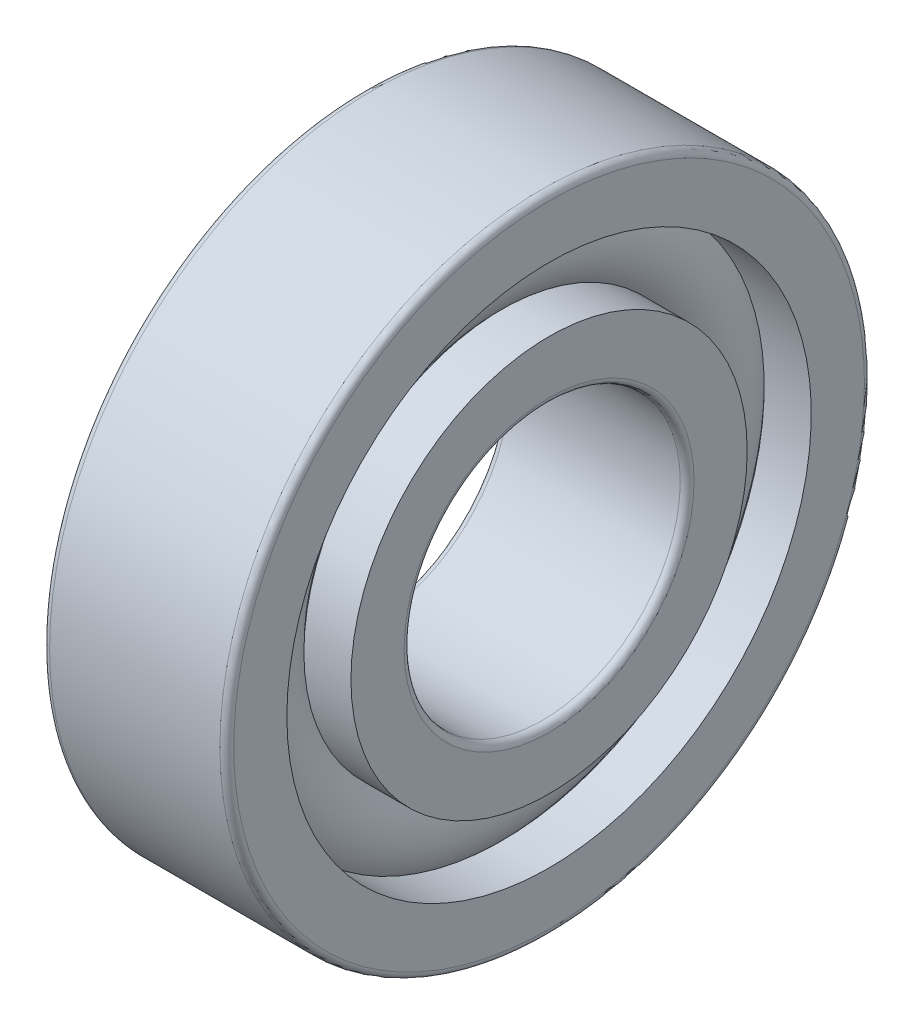
ISO-10303-21;
HEADER;
FILE_DESCRIPTION(('STEP AP214'),'2;1');
FILE_NAME('part.step','',(''),(''),'','','');
FILE_SCHEMA(('AUTOMOTIVE_DESIGN { 1 0 10303 214 1 1 1 1 }'));
ENDSEC;
DATA;
#1=APPLICATION_CONTEXT('core data for automotive mechanical design processes');
#2=APPLICATION_PROTOCOL_DEFINITION('international standard','automotive_design',2000,#1);
#3=PRODUCT_CONTEXT('',#1,'mechanical');
#4=PRODUCT('Part','Part','',(#3));
#5=PRODUCT_RELATED_PRODUCT_CATEGORY('part','',(#4));
#6=PRODUCT_DEFINITION_FORMATION('','',#4);
#7=PRODUCT_DEFINITION_CONTEXT('part definition',#1,'design');
#8=PRODUCT_DEFINITION('design','',#6,#7);
#9=PRODUCT_DEFINITION_SHAPE('','',#8);
#10=(LENGTH_UNIT() NAMED_UNIT(*) SI_UNIT(.MILLI.,.METRE.));
#11=(NAMED_UNIT(*) PLANE_ANGLE_UNIT() SI_UNIT($,.RADIAN.));
#12=(NAMED_UNIT(*) SI_UNIT($,.STERADIAN.) SOLID_ANGLE_UNIT());
#13=UNCERTAINTY_MEASURE_WITH_UNIT(LENGTH_MEASURE(1.E-05),#10,'distance_accuracy_value','');
#14=(GEOMETRIC_REPRESENTATION_CONTEXT(3) GLOBAL_UNCERTAINTY_ASSIGNED_CONTEXT((#13)) GLOBAL_UNIT_ASSIGNED_CONTEXT((#10,
#11,#12)) REPRESENTATION_CONTEXT('',''));
#15=CARTESIAN_POINT('',(0.,0.,0.));
#16=DIRECTION('',(0.,0.,1.));
#17=DIRECTION('',(1.,0.,0.));
#18=AXIS2_PLACEMENT_3D('',#15,#16,#17);
#19=CARTESIAN_POINT('',(4.,0.,0.));
#20=DIRECTION('',(-1.,0.,0.));
#21=DIRECTION('',(0.,0.,1.));
#22=AXIS2_PLACEMENT_3D('',#19,#20,#21);
#23=TOROIDAL_SURFACE('',#22,10.,2.4);
#24=CARTESIAN_POINT('',(5.955079538024,0.,0.));
#25=DIRECTION('',(-1.,0.,0.));
#26=DIRECTION('',(0.,0.,1.));
#27=AXIS2_PLACEMENT_3D('',#24,#25,#26);
#28=CIRCLE('',#27,8.608);
#29=CARTESIAN_POINT('',(5.955079538024,0.,8.608));
#30=VERTEX_POINT('',#29);
#31=EDGE_CURVE('P0_E38',#30,#30,#28,.F.);
#32=ORIENTED_EDGE('',*,*,#31,.F.);
#33=EDGE_LOOP('',(#32));
#34=FACE_BOUND('',#33,.T.);
#35=CARTESIAN_POINT('',(2.044920461976,0.,0.));
#36=DIRECTION('',(-1.,0.,0.));
#37=DIRECTION('',(0.,0.,1.));
#38=AXIS2_PLACEMENT_3D('',#35,#36,#37);
#39=CIRCLE('',#38,8.608);
#40=CARTESIAN_POINT('',(2.044920461976,0.,8.608));
#41=VERTEX_POINT('',#40);
#42=EDGE_CURVE('P0_E34',#41,#41,#39,.T.);
#43=ORIENTED_EDGE('',*,*,#42,.F.);
#44=EDGE_LOOP('',(#43));
#45=FACE_BOUND('',#44,.T.);
#46=ADVANCED_FACE('P0_F15',(#34,#45),#23,.F.);
#47=CARTESIAN_POINT('',(8.4,0.,0.));
#48=DIRECTION('',(-1.,0.,0.));
#49=DIRECTION('',(0.,0.,1.));
#50=AXIS2_PLACEMENT_3D('',#47,#48,#49);
#51=CYLINDRICAL_SURFACE('',#50,8.608);
#52=ORIENTED_EDGE('',*,*,#31,.T.);
#53=EDGE_LOOP('',(#52));
#54=FACE_BOUND('',#53,.T.);
#55=CARTESIAN_POINT('',(8.,0.,0.));
#56=DIRECTION('',(-1.,0.,0.));
#57=DIRECTION('',(0.,0.,1.));
#58=AXIS2_PLACEMENT_3D('',#55,#56,#57);
#59=CIRCLE('',#58,8.608);
#60=CARTESIAN_POINT('',(8.,0.,8.608));
#61=VERTEX_POINT('',#60);
#62=EDGE_CURVE('P0_E37',#61,#61,#59,.F.);
#63=ORIENTED_EDGE('',*,*,#62,.F.);
#64=EDGE_LOOP('',(#63));
#65=FACE_BOUND('',#64,.T.);
#66=ADVANCED_FACE('P0_F51',(#54,#65),#51,.T.);
#67=CARTESIAN_POINT('',(8.4,0.,0.));
#68=DIRECTION('',(-1.,0.,0.));
#69=DIRECTION('',(0.,0.,1.));
#70=AXIS2_PLACEMENT_3D('',#67,#68,#69);
#71=CYLINDRICAL_SURFACE('',#70,8.608);
#72=ORIENTED_EDGE('',*,*,#42,.T.);
#73=EDGE_LOOP('',(#72));
#74=FACE_BOUND('',#73,.T.);
#75=CARTESIAN_POINT('',(0.,0.,0.));
#76=DIRECTION('',(-1.,0.,0.));
#77=DIRECTION('',(0.,0.,1.));
#78=AXIS2_PLACEMENT_3D('',#75,#76,#77);
#79=CIRCLE('',#78,8.608);
#80=CARTESIAN_POINT('',(0.,0.,8.608));
#81=VERTEX_POINT('',#80);
#82=EDGE_CURVE('P0_E43',#81,#81,#79,.F.);
#83=ORIENTED_EDGE('',*,*,#82,.T.);
#84=EDGE_LOOP('',(#83));
#85=FACE_BOUND('',#84,.T.);
#86=ADVANCED_FACE('P0_F53',(#74,#85),#71,.T.);
#87=CARTESIAN_POINT('',(8.,0.,0.));
#88=DIRECTION('',(1.,0.,0.));
#89=DIRECTION('',(0.,0.,-1.));
#90=AXIS2_PLACEMENT_3D('',#87,#88,#89);
#91=PLANE('',#90);
#92=ORIENTED_EDGE('',*,*,#62,.T.);
#93=EDGE_LOOP('',(#92));
#94=FACE_BOUND('',#93,.T.);
#95=CARTESIAN_POINT('',(8.,0.,0.));
#96=DIRECTION('',(1.,0.,0.));
#97=DIRECTION('',(0.,0.,-1.));
#98=AXIS2_PLACEMENT_3D('',#95,#96,#97);
#99=CIRCLE('',#98,6.3);
#100=CARTESIAN_POINT('',(8.,0.,-6.3));
#101=VERTEX_POINT('',#100);
#102=EDGE_CURVE('P0_E31',#101,#101,#99,.T.);
#103=ORIENTED_EDGE('',*,*,#102,.F.);
#104=EDGE_LOOP('',(#103));
#105=FACE_BOUND('',#104,.T.);
#106=ADVANCED_FACE('P0_F48',(#94,#105),#91,.T.);
#107=CARTESIAN_POINT('',(0.,0.,0.));
#108=DIRECTION('',(1.,0.,0.));
#109=DIRECTION('',(0.,0.,-1.));
#110=AXIS2_PLACEMENT_3D('',#107,#108,#109);
#111=PLANE('',#110);
#112=ORIENTED_EDGE('',*,*,#82,.F.);
#113=EDGE_LOOP('',(#112));
#114=FACE_BOUND('',#113,.T.);
#115=CARTESIAN_POINT('',(0.,0.,0.));
#116=DIRECTION('',(1.,0.,0.));
#117=DIRECTION('',(0.,0.,-1.));
#118=AXIS2_PLACEMENT_3D('',#115,#116,#117);
#119=CIRCLE('',#118,6.3);
#120=CARTESIAN_POINT('',(0.,0.,-6.3));
#121=VERTEX_POINT('',#120);
#122=EDGE_CURVE('P0_E26',#121,#121,#119,.F.);
#123=ORIENTED_EDGE('',*,*,#122,.F.);
#124=EDGE_LOOP('',(#123));
#125=FACE_BOUND('',#124,.T.);
#126=ADVANCED_FACE('P0_F75',(#114,#125),#111,.F.);
#127=CARTESIAN_POINT('',(7.7,0.,0.));
#128=DIRECTION('',(1.,0.,0.));
#129=DIRECTION('',(0.,0.,-1.));
#130=AXIS2_PLACEMENT_3D('',#127,#128,#129);
#131=TOROIDAL_SURFACE('',#130,6.3,0.299999999999999);
#132=ORIENTED_EDGE('',*,*,#102,.T.);
#133=EDGE_LOOP('',(#132));
#134=FACE_BOUND('',#133,.T.);
#135=CARTESIAN_POINT('',(7.7,0.,0.));
#136=DIRECTION('',(1.,0.,0.));
#137=DIRECTION('',(0.,0.,-1.));
#138=AXIS2_PLACEMENT_3D('',#135,#136,#137);
#139=CIRCLE('',#138,6.);
#140=CARTESIAN_POINT('',(7.7,0.,-6.));
#141=VERTEX_POINT('',#140);
#142=EDGE_CURVE('P0_E10',#141,#141,#139,.F.);
#143=ORIENTED_EDGE('',*,*,#142,.T.);
#144=EDGE_LOOP('',(#143));
#145=FACE_BOUND('',#144,.T.);
#146=ADVANCED_FACE('P0_F72',(#134,#145),#131,.T.);
#147=CARTESIAN_POINT('',(0.3,0.,0.));
#148=DIRECTION('',(1.,0.,0.));
#149=DIRECTION('',(0.,0.,-1.));
#150=AXIS2_PLACEMENT_3D('',#147,#148,#149);
#151=TOROIDAL_SURFACE('',#150,6.3,0.3);
#152=CARTESIAN_POINT('',(0.3,0.,0.));
#153=DIRECTION('',(1.,0.,0.));
#154=DIRECTION('',(0.,0.,-1.));
#155=AXIS2_PLACEMENT_3D('',#152,#153,#154);
#156=CIRCLE('',#155,6.);
#157=CARTESIAN_POINT('',(0.3,0.,-6.));
#158=VERTEX_POINT('',#157);
#159=EDGE_CURVE('P0_E22',#158,#158,#156,.T.);
#160=ORIENTED_EDGE('',*,*,#159,.T.);
#161=EDGE_LOOP('',(#160));
#162=FACE_BOUND('',#161,.T.);
#163=ORIENTED_EDGE('',*,*,#122,.T.);
#164=EDGE_LOOP('',(#163));
#165=FACE_BOUND('',#164,.T.);
#166=ADVANCED_FACE('P0_F17',(#162,#165),#151,.T.);
#167=CARTESIAN_POINT('',(-0.4,0.,0.));
#168=DIRECTION('',(1.,0.,0.));
#169=DIRECTION('',(0.,0.,-1.));
#170=AXIS2_PLACEMENT_3D('',#167,#168,#169);
#171=CYLINDRICAL_SURFACE('',#170,6.);
#172=ORIENTED_EDGE('',*,*,#142,.F.);
#173=EDGE_LOOP('',(#172));
#174=FACE_BOUND('',#173,.T.);
#175=ORIENTED_EDGE('',*,*,#159,.F.);
#176=EDGE_LOOP('',(#175));
#177=FACE_BOUND('',#176,.T.);
#178=ADVANCED_FACE('P0_F65',(#174,#177),#171,.F.);
#179=CLOSED_SHELL('',(#46,#66,#86,#106,#126,#146,#166,#178));
#180=MANIFOLD_SOLID_BREP('P0_B1',#179);
#181=CARTESIAN_POINT('',(4.,0.,0.));
#182=DIRECTION('',(1.,0.,0.));
#183=DIRECTION('',(0.,0.,-1.));
#184=AXIS2_PLACEMENT_3D('',#181,#182,#183);
#185=TOROIDAL_SURFACE('',#184,10.,2.376);
#186=CARTESIAN_POINT('',(4.,0.,-12.376));
#187=VERTEX_POINT('',#186);
#188=VERTEX_LOOP('',#187);
#189=FACE_BOUND('',#188,.T.);
#190=ADVANCED_FACE('P1_F14',(#189),#185,.T.);
#191=CLOSED_SHELL('',(#190));
#192=CARTESIAN_POINT('',(4.,0.,0.));
#193=DIRECTION('',(1.,0.,0.));
#194=DIRECTION('',(0.,0.,-1.));
#195=AXIS2_PLACEMENT_3D('',#192,#193,#194);
#196=TOROIDAL_SURFACE('',#195,10.,2.32848);
#197=CARTESIAN_POINT('',(4.,0.,-12.32848));
#198=VERTEX_POINT('',#197);
#199=VERTEX_LOOP('',#198);
#200=FACE_BOUND('',#199,.T.);
#201=ADVANCED_FACE('P1_F16',(#200),#196,.F.);
#202=CLOSED_SHELL('',(#201));
#203=ORIENTED_CLOSED_SHELL('',*,#202,.T.);
#204=BREP_WITH_VOIDS('P1_B1',#191,(#203));
#205=CARTESIAN_POINT('',(4.00000000000001,0.,0.));
#206=DIRECTION('',(-1.,0.,0.));
#207=DIRECTION('',(0.,0.,1.));
#208=AXIS2_PLACEMENT_3D('',#205,#206,#207);
#209=TOROIDAL_SURFACE('',#208,10.,2.39999999999999);
#210=CARTESIAN_POINT('',(2.044920461976,0.,0.));
#211=DIRECTION('',(-1.,0.,0.));
#212=DIRECTION('',(0.,0.,1.));
#213=AXIS2_PLACEMENT_3D('',#210,#211,#212);
#214=CIRCLE('',#213,11.392);
#215=CARTESIAN_POINT('',(2.044920461976,0.,11.392));
#216=VERTEX_POINT('',#215);
#217=EDGE_CURVE('P2_E66',#216,#216,#214,.T.);
#218=ORIENTED_EDGE('',*,*,#217,.T.);
#219=EDGE_LOOP('',(#218));
#220=FACE_BOUND('',#219,.T.);
#221=CARTESIAN_POINT('',(5.955079538024,0.,0.));
#222=DIRECTION('',(-1.,0.,0.));
#223=DIRECTION('',(0.,0.,1.));
#224=AXIS2_PLACEMENT_3D('',#221,#222,#223);
#225=CIRCLE('',#224,11.392);
#226=CARTESIAN_POINT('',(5.955079538024,0.,11.392));
#227=VERTEX_POINT('',#226);
#228=EDGE_CURVE('P2_E62',#227,#227,#225,.F.);
#229=ORIENTED_EDGE('',*,*,#228,.T.);
#230=EDGE_LOOP('',(#229));
#231=FACE_BOUND('',#230,.T.);
#232=ADVANCED_FACE('P2_F17',(#220,#231),#209,.F.);
#233=CARTESIAN_POINT('',(8.4,0.,0.));
#234=DIRECTION('',(-1.,0.,0.));
#235=DIRECTION('',(0.,0.,1.));
#236=AXIS2_PLACEMENT_3D('',#233,#234,#235);
#237=CYLINDRICAL_SURFACE('',#236,11.392);
#238=ORIENTED_EDGE('',*,*,#217,.F.);
#239=EDGE_LOOP('',(#238));
#240=FACE_BOUND('',#239,.T.);
#241=CARTESIAN_POINT('',(0.,0.,0.));
#242=DIRECTION('',(-1.,0.,0.));
#243=DIRECTION('',(0.,0.,1.));
#244=AXIS2_PLACEMENT_3D('',#241,#242,#243);
#245=CIRCLE('',#244,11.392);
#246=CARTESIAN_POINT('',(0.,0.,11.392));
#247=VERTEX_POINT('',#246);
#248=EDGE_CURVE('P2_E22',#247,#247,#245,.T.);
#249=ORIENTED_EDGE('',*,*,#248,.T.);
#250=EDGE_LOOP('',(#249));
#251=FACE_BOUND('',#250,.T.);
#252=ADVANCED_FACE('P2_F107',(#240,#251),#237,.F.);
#253=CARTESIAN_POINT('',(8.4,0.,0.));
#254=DIRECTION('',(-1.,0.,0.));
#255=DIRECTION('',(0.,0.,1.));
#256=AXIS2_PLACEMENT_3D('',#253,#254,#255);
#257=CYLINDRICAL_SURFACE('',#256,11.392);
#258=ORIENTED_EDGE('',*,*,#228,.F.);
#259=EDGE_LOOP('',(#258));
#260=FACE_BOUND('',#259,.T.);
#261=CARTESIAN_POINT('',(8.,0.,0.));
#262=DIRECTION('',(-1.,0.,0.));
#263=DIRECTION('',(0.,0.,1.));
#264=AXIS2_PLACEMENT_3D('',#261,#262,#263);
#265=CIRCLE('',#264,11.392);
#266=CARTESIAN_POINT('',(8.,0.,11.392));
#267=VERTEX_POINT('',#266);
#268=EDGE_CURVE('P2_E50',#267,#267,#265,.T.);
#269=ORIENTED_EDGE('',*,*,#268,.F.);
#270=EDGE_LOOP('',(#269));
#271=FACE_BOUND('',#270,.T.);
#272=ADVANCED_FACE('P2_F105',(#260,#271),#257,.F.);
#273=CARTESIAN_POINT('',(0.,0.,0.));
#274=DIRECTION('',(1.,0.,0.));
#275=DIRECTION('',(0.,0.,-1.));
#276=AXIS2_PLACEMENT_3D('',#273,#274,#275);
#277=PLANE('',#276);
#278=CARTESIAN_POINT('',(0.,0.,0.));
#279=DIRECTION('',(1.,0.,0.));
#280=DIRECTION('',(0.,0.,-1.));
#281=AXIS2_PLACEMENT_3D('',#278,#279,#280);
#282=CIRCLE('',#281,13.7);
#283=CARTESIAN_POINT('',(0.,13.7,0.));
#284=VERTEX_POINT('',#283);
#285=CARTESIAN_POINT('',(0.,-13.7,0.));
#286=VERTEX_POINT('',#285);
#287=EDGE_CURVE('P2_E49',#284,#286,#282,.T.);
#288=ORIENTED_EDGE('',*,*,#287,.F.);
#289=CARTESIAN_POINT('',(0.,-13.7,0.));
#290=CARTESIAN_POINT('',(7.12575961330409E-08,-13.7000264446805,-0.19941302660616));
#291=CARTESIAN_POINT('',(3.1095265572047E-08,-13.6956797696379,-0.398807710331764));
#292=CARTESIAN_POINT('',(-1.75057777832564E-08,-13.678333121878,-0.797191899405679));
#293=CARTESIAN_POINT('',(-2.5949090656611E-08,-13.6653344042528,-0.996181459323522));
#294=CARTESIAN_POINT('',(2.76950572690139E-07,-13.6264610709133,-1.44305422126362));
#295=CARTESIAN_POINT('',(6.68688450928796E-07,-13.5981814634795,-1.69073637100772));
#296=CARTESIAN_POINT('',(7.92454818932471E-07,-13.5493553384071,-2.03306137470092));
#297=CARTESIAN_POINT('',(7.81531820052417E-07,-13.5346725201793,-2.12857187807838));
#298=CARTESIAN_POINT('',(6.4314785019681E-07,-13.4821426131723,-2.4474588281604));
#299=CARTESIAN_POINT('',(3.78744194048559E-07,-13.4396935032061,-2.67009463315219));
#300=CARTESIAN_POINT('',(4.57723777513557E-08,-13.3373433095603,-3.14285501508359));
#301=CARTESIAN_POINT('',(8.40957407257155E-09,-13.2758609938742,-3.39263928126099));
#302=CARTESIAN_POINT('',(-4.3427285446078E-10,-13.1894694263677,-3.7057879312237));
#303=CARTESIAN_POINT('',(-1.70230046535177E-10,-13.1709730439398,-3.77096308018605));
#304=CARTESIAN_POINT('',(3.17502885450529E-10,-13.1166138440587,-3.95729875384133));
#305=CARTESIAN_POINT('',(3.08687062887801E-10,-13.0795696182176,-4.07811667676911));
#306=CARTESIAN_POINT('',(8.99963704682974E-10,-12.9634316124417,-4.43895405728988));
#307=CARTESIAN_POINT('',(2.11766234942802E-09,-12.8793264750997,-4.6773801673291));
#308=CARTESIAN_POINT('',(4.20469470623958E-09,-12.698065985725,-5.14920459651641));
#309=CARTESIAN_POINT('',(5.07402790164998E-09,-12.6009106143381,-5.38260290820735));
#310=CARTESIAN_POINT('',(6.16570955941209E-09,-12.3938323386054,-5.84366935855084));
#311=CARTESIAN_POINT('',(6.38805761053657E-09,-12.2839094261446,-6.07133749356116));
#312=CARTESIAN_POINT('',(6.00375179699858E-09,-12.0516361147668,-6.52024325440184));
#313=CARTESIAN_POINT('',(5.39709810797532E-09,-11.9292857184828,-6.74148088159462));
#314=CARTESIAN_POINT('',(3.70709132737951E-09,-11.6725344019273,-7.17684570117889));
#315=CARTESIAN_POINT('',(2.62373874079516E-09,-11.5381334944215,-7.39097290110251));
#316=CARTESIAN_POINT('',(7.76288832690905E-10,-11.2576815883851,-7.81147147696382));
#317=CARTESIAN_POINT('',(1.21909024136124E-11,-11.1116306120695,-8.01784286768965));
#318=CARTESIAN_POINT('',(-7.09967621245888E-12,-10.8716183527297,-8.33783227751425));
#319=CARTESIAN_POINT('',(2.41253190983849E-10,-10.7813410637494,-8.45423279059419));
#320=CARTESIAN_POINT('',(5.10379790440767E-10,-10.5970820720063,-8.68406871361518));
#321=CARTESIAN_POINT('',(5.31154141949373E-10,-10.5031003793239,-8.79750413162351));
#322=CARTESIAN_POINT('',(3.29469451043909E-10,-10.3115316146439,-9.02128746292111));
#323=CARTESIAN_POINT('',(1.0701082230683E-10,-10.2139445487784,-9.13163538146108));
#324=CARTESIAN_POINT('',(-7.3809562919653E-11,-10.0152672238076,-9.34912881274367));
#325=CARTESIAN_POINT('',(-3.21714991141616E-11,-9.91417696708593,-9.45627432766531));
#326=CARTESIAN_POINT('',(2.10181243176736E-09,-9.68803666350352,-9.6883545398871));
#327=CARTESIAN_POINT('',(4.60258897181865E-09,-9.56223790146584,-9.81256181212269));
#328=CARTESIAN_POINT('',(1.25315659274383E-08,-9.34252391205702,-10.0212574876087));
#329=CARTESIAN_POINT('',(1.69202320369668E-08,-9.24975905246469,-10.1069620648519));
#330=CARTESIAN_POINT('',(2.63703249578612E-08,-9.03840645567353,-10.2968731309517));
#331=CARTESIAN_POINT('',(3.13256819499533E-08,-8.91916037533,-10.4003490679297));
#332=CARTESIAN_POINT('',(3.92963479937223E-08,-8.67716165533357,-10.6031126476237));
#333=CARTESIAN_POINT('',(4.23116563503873E-08,-8.55440901442447,-10.7024002888392));
#334=CARTESIAN_POINT('',(4.53692869101528E-08,-8.30554200745829,-10.8966697657679));
#335=CARTESIAN_POINT('',(4.54116115938992E-08,-8.1794276442063,-10.9916516050739));
#336=CARTESIAN_POINT('',(4.25659581451194E-08,-7.92398899719984,-11.1771954150112));
#337=CARTESIAN_POINT('',(3.96779859524128E-08,-7.79466471995251,-11.2677573946014));
#338=CARTESIAN_POINT('',(3.1744259097312E-08,-7.53296083035419,-11.4443525505503));
#339=CARTESIAN_POINT('',(2.66985113822955E-08,-7.40058122784171,-11.5303857414894));
#340=CARTESIAN_POINT('',(1.65769320630593E-08,-7.13292629578985,-11.6978222626572));
#341=CARTESIAN_POINT('',(1.15011005916772E-08,-6.99765097902988,-11.7792256133128));
#342=CARTESIAN_POINT('',(2.64668129885309E-09,-6.72436335251502,-11.9372973818889));
#343=CARTESIAN_POINT('',(-1.13191379343374E-09,-6.58635105810511,-12.0139658263462));
#344=CARTESIAN_POINT('',(1.21531028803691E-09,-6.29750487784882,-12.1679762214038));
#345=CARTESIAN_POINT('',(8.09129903151601E-09,-6.14647545800928,-12.2449516849579));
#346=CARTESIAN_POINT('',(-7.67304705505099E-09,-5.82264708449782,-12.4025308499311));
#347=CARTESIAN_POINT('',(-3.41059977269501E-08,-5.64948454400225,-12.4823875187118));
#348=CARTESIAN_POINT('',(6.58072448647881E-08,-5.30003353721005,-12.6349121477596));
#349=CARTESIAN_POINT('',(1.92137394825316E-07,-5.12374540108169,-12.7075808620444));
#350=CARTESIAN_POINT('',(2.3330649103724E-07,-4.86426250775017,-12.8080840912236));
#351=CARTESIAN_POINT('',(2.25528665946533E-07,-4.78222350939676,-12.838931764991));
#352=CARTESIAN_POINT('',(1.7558512461266E-07,-4.52395095806357,-12.9332030539503));
#353=CARTESIAN_POINT('',(1.04376256982565E-07,-4.34667041868007,-12.9937887344845));
#354=CARTESIAN_POINT('',(2.35386918926536E-08,-4.00705401459641,-13.1021318887051));
#355=CARTESIAN_POINT('',(8.61694261178522E-09,-3.84493239723606,-13.1505634151591));
#356=CARTESIAN_POINT('',(-2.16172202620268E-10,-3.57907989554855,-13.2246801508659));
#357=CARTESIAN_POINT('',(1.56179756345891E-10,-3.47584819112572,-13.2521704753014));
#358=CARTESIAN_POINT('',(-3.19268914729906E-10,-3.16063828854717,-13.3322087555106));
#359=CARTESIAN_POINT('',(-2.8473781128897E-09,-2.94767836378623,-13.3809439908497));
#360=CARTESIAN_POINT('',(2.22466533364702E-08,-2.51968671829212,-13.4681952913557));
#361=CARTESIAN_POINT('',(4.98667021631096E-08,-2.30465514232587,-13.5067120652969));
#362=CARTESIAN_POINT('',(1.25926767417748E-07,-2.02410660294031,-13.5500871293497));
#363=CARTESIAN_POINT('',(1.46259781608402E-07,-1.95929284773043,-13.5596334110932));
#364=CARTESIAN_POINT('',(2.13629798964592E-07,-1.8295368104984,-13.577809043188));
#365=CARTESIAN_POINT('',(2.60666324225506E-07,-1.76459453079714,-13.5864384099457));
#366=CARTESIAN_POINT('',(3.13242531187281E-07,-1.60487610056644,-13.60644806165));
#367=CARTESIAN_POINT('',(2.89986830280838E-07,-1.51003172511482,-13.6172828077284));
#368=CARTESIAN_POINT('',(2.05401075267244E-07,-1.22812555813775,-13.6464891323992));
#369=CARTESIAN_POINT('',(1.2901305907232E-07,-1.04075881953009,-13.6619907093963));
#370=CARTESIAN_POINT('',(3.42772625043589E-08,-0.67888092248283,-13.6844400678649));
#371=CARTESIAN_POINT('',(1.21912956816036E-08,-0.504402233897241,-13.691917348643));
#372=CARTESIAN_POINT('',(-8.3147917644264E-10,-0.219920328175602,-13.6986996077054));
#373=CARTESIAN_POINT('',(-2.73041330960803E-10,-0.109961014773663,-13.7000052566965));
#374=CARTESIAN_POINT('',(3.42540582164872E-10,0.137946719300702,-13.6999934054444));
#375=CARTESIAN_POINT('',(2.35930750547121E-10,0.27589611619392,-13.6979237277847));
#376=CARTESIAN_POINT('',(5.96306293393804E-10,0.551667955925799,-13.6896075499297));
#377=CARTESIAN_POINT('',(1.06329231641081E-09,0.689490398620739,-13.6833610450117));
#378=CARTESIAN_POINT('',(2.1363667945551E-09,0.964884321527671,-13.6667109829728));
#379=CARTESIAN_POINT('',(2.74245540067073E-09,1.10245580146709,-13.6563074213396));
#380=CARTESIAN_POINT('',(4.17167856263692E-09,1.37722178249909,-13.6313489582131));
#381=CARTESIAN_POINT('',(4.99481334426301E-09,1.51441628319937,-13.6167940524015));
#382=CARTESIAN_POINT('',(6.80038811246604E-09,1.78830323249092,-13.5835471854649));
#383=CARTESIAN_POINT('',(7.78282825755004E-09,1.92499568058252,-13.5648552202235));
#384=CARTESIAN_POINT('',(9.88725222561832E-09,2.1977537487481,-13.5233510130001));
#385=CARTESIAN_POINT('',(1.10092361811357E-08,2.33381936822662,-13.5005387671048));
#386=CARTESIAN_POINT('',(1.33644326816504E-08,2.60519961811836,-13.4508148810197));
#387=CARTESIAN_POINT('',(1.45976453272575E-08,2.74051424785218,-13.4239032371219));
#388=CARTESIAN_POINT('',(1.71508986920156E-08,3.01026903083746,-13.3660050868387));
#389=CARTESIAN_POINT('',(1.84709394857781E-08,3.14470918333739,-13.3350185769518));
#390=CARTESIAN_POINT('',(2.11740226481432E-08,3.41259232540179,-13.2689989701548));
#391=CARTESIAN_POINT('',(2.25570650680334E-08,3.54603531415441,-13.2339658699506));
#392=CARTESIAN_POINT('',(2.53637938310511E-08,3.81180235130109,-13.1598850445747));
#393=CARTESIAN_POINT('',(2.67874802054271E-08,3.94412639883478,-13.1208373163163));
#394=CARTESIAN_POINT('',(2.96543685552081E-08,4.2075347973538,-13.0387628626888));
#395=CARTESIAN_POINT('',(3.10975705447345E-08,4.33861914744199,-12.9957361344404));
#396=CARTESIAN_POINT('',(3.39836551318156E-08,4.59942852605385,-12.9057429397328));
#397=CARTESIAN_POINT('',(3.54265377291529E-08,4.72915355365529,-12.8587764706009));
#398=CARTESIAN_POINT('',(3.82934248457468E-08,4.98712590271568,-12.7609466488427));
#399=CARTESIAN_POINT('',(3.97174293530497E-08,5.11537322323893,-12.710083293749));
#400=CARTESIAN_POINT('',(4.25292823260357E-08,5.37027312204004,-12.6045061113283));
#401=CARTESIAN_POINT('',(4.39171307704604E-08,5.49692569938023,-12.5497922817375));
#402=CARTESIAN_POINT('',(4.66406734121251E-08,5.74852053101899,-12.4365640758146));
#403=CARTESIAN_POINT('',(4.79763675810595E-08,5.87346278438931,-12.37804969742));
#404=CARTESIAN_POINT('',(5.05808832099948E-08,6.12152294809532,-12.2572737880357));
#405=CARTESIAN_POINT('',(5.18497046367266E-08,6.24464085752338,-12.1950122551818));
#406=CARTESIAN_POINT('',(5.43070363266539E-08,6.4889399782287,-12.0667988509511));
#407=CARTESIAN_POINT('',(5.5495546553527E-08,6.61012118863003,-12.0008469779053));
#408=CARTESIAN_POINT('',(5.77800971171031E-08,6.85043632359609,-11.8653130754342));
#409=CARTESIAN_POINT('',(5.8876137416167E-08,6.96957024732748,-11.7957310445313));
#410=CARTESIAN_POINT('',(6.09648693293566E-08,7.20568208963863,-11.6530003216337));
#411=CARTESIAN_POINT('',(6.19575609060893E-08,7.32266000743831,-11.5798516283484));
#412=CARTESIAN_POINT('',(6.38299964100283E-08,7.55435308617669,-11.4300543311649));
#413=CARTESIAN_POINT('',(6.47097403014768E-08,7.66906824639902,-11.3534057261586));
#414=CARTESIAN_POINT('',(6.63479613959075E-08,7.89613112331797,-11.1966785502797));
#415=CARTESIAN_POINT('',(6.71064385659826E-08,8.00847883937215,-11.1165999784763));
#416=CARTESIAN_POINT('',(6.84950869336494E-08,8.23070430188855,-10.9530859441776));
#417=CARTESIAN_POINT('',(6.91252581022269E-08,8.34058204779222,-10.8696504809232));
#418=CARTESIAN_POINT('',(7.02515350925974E-08,8.55776729812157,-10.6994988026274));
#419=CARTESIAN_POINT('',(7.07476408901371E-08,8.66507480208227,-10.6127825869926));
#420=CARTESIAN_POINT('',(7.16013076601231E-08,8.87702164234394,-10.4361485370775));
#421=CARTESIAN_POINT('',(7.19588686137715E-08,8.98166097828288,-10.3462307023629));
#422=CARTESIAN_POINT('',(7.25322460148038E-08,9.18817599140639,-10.1632754694387));
#423=CARTESIAN_POINT('',(7.27480624493665E-08,9.29005166834098,-10.0702380709469));
#424=CARTESIAN_POINT('',(7.30360310131135E-08,9.4909463946083,-9.88112861273342));
#425=CARTESIAN_POINT('',(7.31081831358005E-08,9.58996544381183,-9.7850565528744));
#426=CARTESIAN_POINT('',(7.31081831358005E-08,9.78505655287439,-9.58996544381183));
#427=CARTESIAN_POINT('',(7.30360310131136E-08,9.88112861273342,-9.4909463946083));
#428=CARTESIAN_POINT('',(7.27480624493665E-08,10.0702380709469,-9.29005166834099));
#429=CARTESIAN_POINT('',(7.25322460148038E-08,10.1632754694387,-9.1881759914064));
#430=CARTESIAN_POINT('',(7.19588686137715E-08,10.3462307023629,-8.98166097828289));
#431=CARTESIAN_POINT('',(7.16013076601231E-08,10.4361485370775,-8.87702164234395));
#432=CARTESIAN_POINT('',(7.07476408901371E-08,10.6127825869926,-8.66507480208228));
#433=CARTESIAN_POINT('',(7.02515350925973E-08,10.6994988026274,-8.55776729812157));
#434=CARTESIAN_POINT('',(6.9125258102227E-08,10.8696504809231,-8.34058204779222));
#435=CARTESIAN_POINT('',(6.84950869336498E-08,10.9530859441776,-8.23070430188856));
#436=CARTESIAN_POINT('',(6.71064385659823E-08,11.1165999784763,-8.00847883937216));
#437=CARTESIAN_POINT('',(6.63479613959062E-08,11.1966785502797,-7.89613112331798));
#438=CARTESIAN_POINT('',(6.47097403014781E-08,11.3534057261586,-7.66906824639903));
#439=CARTESIAN_POINT('',(6.38299964100329E-08,11.4300543311649,-7.5543530861767));
#440=CARTESIAN_POINT('',(6.19575609060846E-08,11.5798516283484,-7.32266000743831));
#441=CARTESIAN_POINT('',(6.09648693293393E-08,11.6530003216337,-7.20568208963864));
#442=CARTESIAN_POINT('',(5.88761374161844E-08,11.7957310445313,-6.96957024732749));
#443=CARTESIAN_POINT('',(5.77800971171679E-08,11.8653130754342,-6.8504363235961));
#444=CARTESIAN_POINT('',(5.54955465534623E-08,12.0008469779053,-6.61012118863004));
#445=CARTESIAN_POINT('',(5.43070363264122E-08,12.0667988509512,-6.48893997822871));
#446=CARTESIAN_POINT('',(5.18497046369683E-08,12.1950122551818,-6.24464085752338));
#447=CARTESIAN_POINT('',(5.05808832108968E-08,12.2572737880356,-6.12152294809532));
#448=CARTESIAN_POINT('',(4.79763675801575E-08,12.37804969742,-5.87346278438932));
#449=CARTESIAN_POINT('',(4.66406734087588E-08,12.4365640758147,-5.74852053101901));
#450=CARTESIAN_POINT('',(4.39171307738268E-08,12.5497922817373,-5.49692569938022));
#451=CARTESIAN_POINT('',(4.2529282338599E-08,12.6045061113278,-5.37027312203999));
#452=CARTESIAN_POINT('',(3.97174293404864E-08,12.7100832937494,-5.115373223239));
#453=CARTESIAN_POINT('',(3.82934247988598E-08,12.7609466488444,-4.98712590271589));
#454=CARTESIAN_POINT('',(3.54265377760398E-08,12.8587764705992,-4.72915355365509));
#455=CARTESIAN_POINT('',(3.39836553067999E-08,12.9057429397264,-4.59942852605308));
#456=CARTESIAN_POINT('',(3.10975703697504E-08,12.9957361344469,-4.33861914744278));
#457=CARTESIAN_POINT('',(2.96543679021585E-08,13.0387628627129,-4.20753479735672));
#458=CARTESIAN_POINT('',(2.67874808584762E-08,13.1208373162921,-3.9441263988319));
#459=CARTESIAN_POINT('',(2.53637962682629E-08,13.1598850444846,-3.81180235129028));
#460=CARTESIAN_POINT('',(2.25570626308235E-08,13.2339658700407,-3.54603531416524));
#461=CARTESIAN_POINT('',(2.11740135523553E-08,13.2689989704909,-3.41259232544219));
#462=CARTESIAN_POINT('',(1.84709485815586E-08,13.3350185766157,-3.14470918329702));
#463=CARTESIAN_POINT('',(1.71509326379168E-08,13.3660050855845,-3.01026903068677));
#464=CARTESIAN_POINT('',(1.45976113813854E-08,13.4239032383761,-2.7405142480029));
#465=CARTESIAN_POINT('',(1.33643059939853E-08,13.4508148857005,-2.60519961868084));
#466=CARTESIAN_POINT('',(1.10093628686862E-08,13.5005387624241,-2.33381936766417));
#467=CARTESIAN_POINT('',(9.88772502978055E-09,13.5233509955313,-2.19775374664897));
#468=CARTESIAN_POINT('',(7.78235545383691E-09,13.5648552376923,-1.92499568268166));
#469=CARTESIAN_POINT('',(6.79862358582143E-09,13.5835472506594,-1.788303240325));
#470=CARTESIAN_POINT('',(4.99657786915191E-09,13.616793987207,-1.51441627536533));
#471=CARTESIAN_POINT('',(4.17826385590893E-09,13.6313487149041,-1.37722175326202));
#472=CARTESIAN_POINT('',(2.73587011424886E-09,13.6563076646482,-1.10245583070417));
#473=CARTESIAN_POINT('',(2.11179018378591E-09,13.6667118910127,-0.964884430641811));
#474=CARTESIAN_POINT('',(1.08786890050337E-09,13.6833601369728,-0.689490289506722));
#475=CARTESIAN_POINT('',(6.88027304284709E-10,13.6896041610842,-0.551667548706968));
#476=CARTESIAN_POINT('',(1.44209843363173E-10,13.6979271166264,-0.275896523412303));
#477=CARTESIAN_POINT('',(2.33689358959557E-13,13.7000060527665,-0.137948239059518));
#478=CARTESIAN_POINT('',(0.,13.7,0.));
#479=B_SPLINE_CURVE_WITH_KNOTS('',3,(#289,#290,#291,#292,#293,#294,#295,#296,#297,#298,#299,
#300,#301,#302,#303,#304,#305,#306,#307,#308,#309,#310,#311,#312,#313,#314,#315,#316,#317,#318,
#319,#320,#321,#322,#323,#324,#325,#326,#327,#328,#329,#330,#331,#332,#333,#334,#335,#336,#337,
#338,#339,#340,#341,#342,#343,#344,#345,#346,#347,#348,#349,#350,#351,#352,#353,#354,#355,#356,
#357,#358,#359,#360,#361,#362,#363,#364,#365,#366,#367,#368,#369,#370,#371,#372,#373,#374,#375,
#376,#377,#378,#379,#380,#381,#382,#383,#384,#385,#386,#387,#388,#389,#390,#391,#392,#393,#394,
#395,#396,#397,#398,#399,#400,#401,#402,#403,#404,#405,#406,#407,#408,#409,#410,#411,#412,#413,
#414,#415,#416,#417,#418,#419,#420,#421,#422,#423,#424,#425,#426,#427,#428,#429,#430,#431,#432,
#433,#434,#435,#436,#437,#438,#439,#440,#441,#442,#443,#444,#445,#446,#447,#448,#449,#450,#451,
#452,#453,#454,#455,#456,#457,#458,#459,#460,#461,#462,#463,#464,#465,#466,#467,#468,#469,#470,
#471,#472,#473,#474,#475,#476,#477,#478),.UNSPECIFIED.,.F.,.F.,(4,2,2,2,2,2,2,2,2,2,2,2,2,2,2,2,
2,2,2,2,2,2,2,2,2,2,2,2,2,2,2,2,2,2,2,2,2,2,2,2,2,2,2,2,2,2,2,2,2,2,2,2,2,2,2,2,2,2,2,2,2,2,2,2,
2,2,2,2,2,2,2,2,2,2,2,2,2,2,2,2,2,2,2,2,2,2,2,2,2,2,2,2,2,2,4),(0.,0.598155408381074,
1.19622406538689,1.94366336744746,2.23354768662691,2.91319035592887,3.68445456193326,
3.88769782149777,4.26676180826637,5.02481843313213,5.78287618225731,6.54093441320797,
7.29899248355013,8.05704975084985,8.81510557267316,9.2569571311492,9.69880748733355,
10.1406570920448,10.5825063960987,11.1127157064784,11.4915605007611,11.9651086160566,
12.438656900998,12.9122047908127,13.3857517207302,13.8592971259828,14.3328404418051,
14.8063811034341,15.31480768301,15.886716582439,16.4585654247535,16.7214950835991,
17.2833608137723,17.790845752602,18.1113116448355,18.7664449029231,19.4215327076758,
19.6180678479145,19.8145994709343,20.1009641743136,20.664811771306,21.1885974918988,
21.5184715792053,21.9323005004817,22.3461298896661,22.7599597280422,23.1737899968935,
23.5876206775038,24.0014517511568,24.4152831991361,24.8291150027255,25.2429471432085,
25.6567796018689,26.0706123599904,26.4844453988567,26.8982786997513,27.3121122439581,
27.7259460127606,28.1397799874426,28.5536141492877,28.9674484795797,29.3812829596022,
29.7951175706389,30.2089522939734,30.6227871108896,31.036622002671,31.4504569506013,
31.8642919359643,32.2781269400436,32.6919619441228,33.1057969294858,33.5196318774161,
33.9334667691975,34.3473015861137,34.7611363094482,35.1749709204849,35.5888054005074,
36.0026397307994,36.4164738926445,36.8303078673266,37.2441416361291,37.6579751803358,
38.0718084812305,38.4856415200967,38.8994742782182,39.3133067368786,39.7271388773617,
40.140970680951,40.5548021289304,40.9686332025833,41.3824638831937,41.796294152045,
42.210123990421,42.6239533796054,43.0377823008819),.UNSPECIFIED.);
#480=EDGE_CURVE('P2_E44',#286,#284,#479,.T.);
#481=ORIENTED_EDGE('',*,*,#480,.F.);
#482=EDGE_LOOP('',(#288,#481));
#483=FACE_BOUND('',#482,.T.);
#484=ORIENTED_EDGE('',*,*,#248,.F.);
#485=EDGE_LOOP('',(#484));
#486=FACE_BOUND('',#485,.T.);
#487=ADVANCED_FACE('P2_F52',(#483,#486),#277,.F.);
#488=CARTESIAN_POINT('',(8.,0.,0.));
#489=DIRECTION('',(1.,0.,0.));
#490=DIRECTION('',(0.,0.,-1.));
#491=AXIS2_PLACEMENT_3D('',#488,#489,#490);
#492=PLANE('',#491);
#493=CARTESIAN_POINT('',(8.,13.7,0.));
#494=CARTESIAN_POINT('',(7.99999999956283,13.700000051563,-0.108035025615389));
#495=CARTESIAN_POINT('',(8.00000000023045,13.6987286976149,-0.216070093967719));
#496=CARTESIAN_POINT('',(7.99999999842298,13.69364463594,-0.432070328697276));
#497=CARTESIAN_POINT('',(7.99999999594817,13.6898321653725,-0.540035500656706));
#498=CARTESIAN_POINT('',(7.99999998250603,13.6796677865613,-0.755836388230748));
#499=CARTESIAN_POINT('',(7.99999997153947,13.673316107852,-0.863672114663227));
#500=CARTESIAN_POINT('',(7.99999991938415,13.6580806331367,-1.0791553080138));
#501=CARTESIAN_POINT('',(7.99999987819803,13.6491970585764,-1.18680279056809));
#502=CARTESIAN_POINT('',(7.9999997770638,13.6288918163832,-1.40184825004461));
#503=CARTESIAN_POINT('',(7.99999971711728,13.6174703632715,-1.50924624728044));
#504=CARTESIAN_POINT('',(7.99999944123775,13.5921394312883,-1.72374129540626));
#505=CARTESIAN_POINT('',(7.99999922531748,13.5782301554057,-1.83083837012582));
#506=CARTESIAN_POINT('',(7.99999907093665,13.5542247427098,-1.99934293664787));
#507=CARTESIAN_POINT('',(7.99999905366709,13.5450109824366,-2.06087727904103));
#508=CARTESIAN_POINT('',(7.99999908662984,13.5186707504059,-2.22876611732488));
#509=CARTESIAN_POINT('',(7.99999919546671,13.5006855108511,-2.3349867543537));
#510=CARTESIAN_POINT('',(7.99999945035929,13.4540779524691,-2.59174426969589));
#511=CARTESIAN_POINT('',(7.9999995927187,13.4241713805257,-2.74204934105611));
#512=CARTESIAN_POINT('',(7.99999981225924,13.360762089734,-3.03494754669729));
#513=CARTESIAN_POINT('',(7.99999989204386,13.327476833104,-3.17758782987158));
#514=CARTESIAN_POINT('',(7.99999997285983,13.2656349650509,-3.42468102882137));
#515=CARTESIAN_POINT('',(7.999999989002,13.2381086148052,-3.52939261428614));
#516=CARTESIAN_POINT('',(7.99999999974249,13.190751036214,-3.70132078798989));
#517=CARTESIAN_POINT('',(7.9999999999318,13.1716305405704,-3.76873416633218));
#518=CARTESIAN_POINT('',(8.00000000013323,13.1136515718392,-3.96740437884714));
#519=CARTESIAN_POINT('',(7.99999999980429,13.0733567125142,-4.09824569836878));
#520=CARTESIAN_POINT('',(7.99999999902085,12.9888527333582,-4.35865569508325));
#521=CARTESIAN_POINT('',(7.99999999856635,12.944643618405,-4.48822437386175));
#522=CARTESIAN_POINT('',(7.99999999754979,12.8523662668329,-4.74598051092352));
#523=CARTESIAN_POINT('',(7.99999999698772,12.8042980340613,-4.87416797058361));
#524=CARTESIAN_POINT('',(7.99999999593395,12.70434146886,-5.12904452295185));
#525=CARTESIAN_POINT('',(7.99999999544225,12.6524531392865,-5.25573361678022));
#526=CARTESIAN_POINT('',(7.99999999461507,12.5449040760481,-5.50750026361576));
#527=CARTESIAN_POINT('',(7.99999999427958,12.4892433442637,-5.63257781742617));
#528=CARTESIAN_POINT('',(7.9999999938261,12.3741991512927,-5.88100895229892));
#529=CARTESIAN_POINT('',(7.99999999370809,12.3148156910339,-6.00436253379092));
#530=CARTESIAN_POINT('',(7.99999999370819,12.1923794316733,-6.24923502756268));
#531=CARTESIAN_POINT('',(7.99999999382629,12.1293266325713,-6.37075393984245));
#532=CARTESIAN_POINT('',(7.99999999427938,11.9996082805425,-6.61184799476755));
#533=CARTESIAN_POINT('',(7.99999999461437,11.9329427267153,-6.73142313692844));
#534=CARTESIAN_POINT('',(7.99999999544294,11.7960587068022,-6.96852230710165));
#535=CARTESIAN_POINT('',(7.99999999593652,11.7258402389454,-7.08604633409156));
#536=CARTESIAN_POINT('',(7.99999999698514,11.5819134576359,-7.31893777212432));
#537=CARTESIAN_POINT('',(7.99999999754018,11.5082051415739,-7.43430518155464));
#538=CARTESIAN_POINT('',(7.99999999857596,11.3573646973961,-7.66277979576408));
#539=CARTESIAN_POINT('',(7.99999999905669,11.280232565867,-7.77588699828988));
#540=CARTESIAN_POINT('',(7.99999999976844,11.1226142164225,-7.99973972233901));
#541=CARTESIAN_POINT('',(7.99999999999945,11.0421279943276,-8.1104852409192));
#542=CARTESIAN_POINT('',(8.00000000000057,10.8740989052637,-8.33454605426373));
#543=CARTESIAN_POINT('',(7.99999999974901,10.7864017214595,-8.44774566494776));
#544=CARTESIAN_POINT('',(7.99999999899234,10.6048591655082,-8.67464042572945));
#545=CARTESIAN_POINT('',(7.99999999847996,10.510908712962,-8.78825150834058));
#546=CARTESIAN_POINT('',(7.99999999738009,10.3166425602068,-9.01559606175977));
#547=CARTESIAN_POINT('',(7.99999999679086,10.2162215821357,-9.12923958755439));
#548=CARTESIAN_POINT('',(7.99999999567712,10.0088093633689,-9.35625069588083));
#549=CARTESIAN_POINT('',(7.99999999515487,9.90171299970226,-9.46952224578286));
#550=CARTESIAN_POINT('',(7.9999999942749,9.68075978457728,-9.69536620560095));
#551=CARTESIAN_POINT('',(7.99999999392201,9.56679835361591,-9.80783631655064));
#552=CARTESIAN_POINT('',(7.99999999344075,9.33194187395171,-10.0316289998081));
#553=CARTESIAN_POINT('',(7.99999999331854,9.21094319760484,-10.142842838112));
#554=CARTESIAN_POINT('',(7.99999999331841,8.96185878235558,-10.3636494390744));
#555=CARTESIAN_POINT('',(7.99999999344686,8.83367080063987,-10.47312688302));
#556=CARTESIAN_POINT('',(7.99999999392814,8.57007664255427,-10.689962160996));
#557=CARTESIAN_POINT('',(7.99999999428651,8.43457006361086,-10.7971979605207));
#558=CARTESIAN_POINT('',(7.99999999516566,8.15623275852777,-11.0090269513055));
#559=CARTESIAN_POINT('',(7.9999999956902,8.01330395100456,-11.1134912870909));
#560=CARTESIAN_POINT('',(7.99999999680625,7.72004390167409,-11.3192299727835));
#561=CARTESIAN_POINT('',(7.99999999739906,7.56961739401075,-11.4203685531761));
#562=CARTESIAN_POINT('',(7.99999999848911,7.26131572025153,-11.6188868732345));
#563=CARTESIAN_POINT('',(7.9999999989838,7.10334865457287,-11.7161239126813));
#564=CARTESIAN_POINT('',(7.99999999977751,6.77994910294111,-11.9062420283289));
#565=CARTESIAN_POINT('',(8.00000000007182,6.61442852488765,-11.9989733037154));
#566=CARTESIAN_POINT('',(7.99999999993046,6.28500520127369,-12.1746621011027));
#567=CARTESIAN_POINT('',(7.99999999951769,6.12121805574905,-12.25783650938));
#568=CARTESIAN_POINT('',(7.99999999803734,5.79045722039472,-12.4175552881737));
#569=CARTESIAN_POINT('',(7.9999999969698,5.62348376599093,-12.4941001462289));
#570=CARTESIAN_POINT('',(7.99999992927307,5.2866235894895,-12.6404549685067));
#571=CARTESIAN_POINT('',(7.99999986264826,5.11673706237921,-12.7102653814447));
#572=CARTESIAN_POINT('',(7.99999969323824,4.77428354784247,-12.84296762678));
#573=CARTESIAN_POINT('',(7.99999959045327,4.60171657745164,-12.9058595031275));
#574=CARTESIAN_POINT('',(7.9999995756164,4.25420780310672,-13.0245748134534));
#575=CARTESIAN_POINT('',(7.99999966352364,4.0792665159528,-13.0803997591618));
#576=CARTESIAN_POINT('',(7.99999985889083,3.72727235162508,-13.1847756165519));
#577=CARTESIAN_POINT('',(7.99999996634624,3.55021997562072,-13.2333282189673));
#578=CARTESIAN_POINT('',(8.00000002518198,3.23918191788336,-13.3122332825936));
#579=CARTESIAN_POINT('',(8.00000000904223,3.105574679184,-13.3440905615779));
#580=CARTESIAN_POINT('',(7.99999997458781,2.82780581371876,-13.4059128870197));
#581=CARTESIAN_POINT('',(7.99999995620021,2.68357664489378,-13.4355767282221));
#582=CARTESIAN_POINT('',(7.99999989352626,2.43437663568128,-13.4826605220274));
#583=CARTESIAN_POINT('',(7.99999985783893,2.3296138170076,-13.5011943013004));
#584=CARTESIAN_POINT('',(7.99999977237967,2.04997333069488,-13.5472944896607));
#585=CARTESIAN_POINT('',(7.99999972899129,1.87473163762549,-13.5726864802343));
#586=CARTESIAN_POINT('',(7.99999970464815,1.51123554308583,-13.6181308679964));
#587=CARTESIAN_POINT('',(7.99999972822204,1.32291990712446,-13.6376921127194));
#588=CARTESIAN_POINT('',(7.99999980672755,0.945656039676494,-13.6689829170494));
#589=CARTESIAN_POINT('',(7.99999986165622,0.756707869460584,-13.6807132143348));
#590=CARTESIAN_POINT('',(7.99999995234771,0.378503968485701,-13.6962329977648));
#591=CARTESIAN_POINT('',(7.99999998811247,0.189248270859684,-13.7000232890687));
#592=CARTESIAN_POINT('',(8.00000000895609,-0.142580177438891,-13.6999824539504));
#593=CARTESIAN_POINT('',(8.0000000043591,-0.285156139328008,-13.6978002594982));
#594=CARTESIAN_POINT('',(7.99999997793159,-0.569586293164315,-13.6890105460464));
#595=CARTESIAN_POINT('',(7.99999995617243,-0.71144103186181,-13.6824213628086));
#596=CARTESIAN_POINT('',(7.99999989306909,-0.959345980699207,-13.6670403260891));
#597=CARTESIAN_POINT('',(7.9999998580015,-1.06545784576533,-13.659214644017));
#598=CARTESIAN_POINT('',(7.99999977343268,-1.34784186788593,-13.6350604076741));
#599=CARTESIAN_POINT('',(7.99999972980169,-1.52393152611636,-13.6165358481032));
#600=CARTESIAN_POINT('',(7.99999970524827,-1.88741916705981,-13.5711075283088));
#601=CARTESIAN_POINT('',(7.99999972887891,-2.07475556174858,-13.5437122372495));
#602=CARTESIAN_POINT('',(7.99999980721391,-2.44811356445332,-13.481175228287));
#603=CARTESIAN_POINT('',(7.99999986191536,-2.63413529439541,-13.4460342387385));
#604=CARTESIAN_POINT('',(7.99999995254044,-3.00452275719035,-13.3679806363854));
#605=CARTESIAN_POINT('',(7.99999998846597,-3.1888886556952,-13.3250688102859));
#606=CARTESIAN_POINT('',(8.00000000838957,-3.50572227189895,-13.2445605340119));
#607=CARTESIAN_POINT('',(8.00000000387419,-3.63863588992617,-13.2087043592412));
#608=CARTESIAN_POINT('',(7.99999998281967,-3.90399256465206,-13.1328156952723));
#609=CARTESIAN_POINT('',(7.99999996622028,-4.03642990759351,-13.0927631402043));
#610=CARTESIAN_POINT('',(7.99999991709823,-4.26664346173655,-13.01931666421));
#611=CARTESIAN_POINT('',(7.99999988967324,-4.36470301120614,-12.9868055105168));
#612=CARTESIAN_POINT('',(7.9999998233912,-4.62467549515824,-12.8973194514294));
#613=CARTESIAN_POINT('',(7.99999978897196,-4.78591992318871,-12.838387628248));
#614=CARTESIAN_POINT('',(7.99999976970019,-5.11721825442851,-12.7101519742678));
#615=CARTESIAN_POINT('',(7.99999978846896,-5.28710302301146,-12.6404115398325));
#616=CARTESIAN_POINT('',(7.99999984821883,-5.62391078746748,-12.4941455798489));
#617=CARTESIAN_POINT('',(7.99999988919819,-5.79083401542873,-12.4176205888323));
#618=CARTESIAN_POINT('',(7.99999996527687,-6.12143469789435,-12.2578886162464));
#619=CARTESIAN_POINT('',(8.00000000037669,-6.28511242740705,-12.1746822038725));
#620=CARTESIAN_POINT('',(7.99999999964444,-6.59991827195041,-12.0066389927536));
#621=CARTESIAN_POINT('',(7.99999996768192,-6.75123522913457,-11.9221556455778));
#622=CARTESIAN_POINT('',(7.99999997856516,-7.05056293364557,-11.7475813607415));
#623=CARTESIAN_POINT('',(8.00000002139841,-7.19857422960441,-11.6574913631425));
#624=CARTESIAN_POINT('',(7.99999997547705,-7.49114152333813,-11.4719032011055));
#625=CARTESIAN_POINT('',(7.99999988674226,-7.63569803868001,-11.3764058540669));
#626=CARTESIAN_POINT('',(7.99999984147207,-7.88400701518787,-11.2052616698964));
#627=CARTESIAN_POINT('',(7.99999985665349,-7.98863232812501,-11.1308782198473));
#628=CARTESIAN_POINT('',(7.99999990011873,-8.19789974776526,-10.9776220926473));
#629=CARTESIAN_POINT('',(7.99999992866805,-8.30249709891627,-10.8986882725272));
#630=CARTESIAN_POINT('',(7.99999996887353,-8.50031647732906,-10.7448972348948));
#631=CARTESIAN_POINT('',(7.99999998179073,-8.59373216527915,-10.6702888544742));
#632=CARTESIAN_POINT('',(7.99999999814901,-8.79489625567716,-10.5052758219675));
#633=CARTESIAN_POINT('',(7.99999999951531,-8.90226448732242,-10.4144072258881));
#634=CARTESIAN_POINT('',(8.00000000055016,-9.12848870326527,-10.2169327597259));
#635=CARTESIAN_POINT('',(7.99999999996439,-9.24693693808017,-10.109859348045));
#636=CARTESIAN_POINT('',(7.99999999925121,-9.48001268608101,-9.8916325087462));
#637=CARTESIAN_POINT('',(7.99999999912382,-9.59464020269063,-9.78047908478447));
#638=CARTESIAN_POINT('',(7.99999999886812,-9.81994353681939,-9.55423705431327));
#639=CARTESIAN_POINT('',(7.99999999873983,-9.93061935610907,-9.439148449567));
#640=CARTESIAN_POINT('',(7.99999999871872,-10.1478818463306,-9.20517409555555));
#641=CARTESIAN_POINT('',(7.99999999882589,-10.2544685172624,-9.08628834629038));
#642=CARTESIAN_POINT('',(7.99999999916605,-10.4634230871163,-8.84486547679433));
#643=CARTESIAN_POINT('',(7.99999999939903,-10.5657909841481,-8.72232835492747));
#644=CARTESIAN_POINT('',(7.99999999981657,-10.7661834698934,-8.47375214661205));
#645=CARTESIAN_POINT('',(8.00000000000113,-10.8642080547148,-8.34771305702546));
#646=CARTESIAN_POINT('',(7.99999999999891,-11.0518658751595,-8.09752131227731));
#647=CARTESIAN_POINT('',(7.99999999982705,-11.1416783715894,-7.97350306159453));
#648=CARTESIAN_POINT('',(7.99999999928839,-11.3154062041715,-7.72494101204505));
#649=CARTESIAN_POINT('',(7.9999999989254,-11.3994017838699,-7.60045329595526));
#650=CARTESIAN_POINT('',(7.9999999981409,-11.5616459868298,-7.35125381245555));
#651=CARTESIAN_POINT('',(7.99999999772066,-11.6399750563744,-7.22659441314373));
#652=CARTESIAN_POINT('',(7.99999999692654,-11.7910460845573,-6.97733634470969));
#653=CARTESIAN_POINT('',(7.99999999655189,-11.8638685113046,-6.852786440352));
#654=CARTESIAN_POINT('',(7.99999999592442,-12.0040948719471,-6.60401628625759));
#655=CARTESIAN_POINT('',(7.99999999566926,-12.0715791178295,-6.47984130087728));
#656=CARTESIAN_POINT('',(7.9999999953261,-12.2013052104356,-6.23207403614984));
#657=CARTESIAN_POINT('',(7.99999999523473,-12.2636270472734,-6.10852363261273));
#658=CARTESIAN_POINT('',(7.9999999952349,-12.3832107869152,-5.86224300350312));
#659=CARTESIAN_POINT('',(7.99999999532258,-12.440552201601,-5.73955138035055));
#660=CARTESIAN_POINT('',(7.99999999566539,-12.5503628193244,-5.49521047336794));
#661=CARTESIAN_POINT('',(7.99999999591685,-12.6029109102852,-5.37359663791252));
#662=CARTESIAN_POINT('',(7.9999999965459,-12.7033269427279,-5.13161854679282));
#663=CARTESIAN_POINT('',(7.99999999692057,-12.7512730098889,-5.01128670676877));
#664=CARTESIAN_POINT('',(7.99999999770952,-12.8426800687206,-4.77206515286263));
#665=CARTESIAN_POINT('',(7.9999999981227,-12.8862183031714,-4.65320494909414));
#666=CARTESIAN_POINT('',(7.99999999892636,-12.9690081987442,-4.41710551166397));
#667=CARTESIAN_POINT('',(7.99999999931714,-13.0083360781538,-4.29989299856381));
#668=CARTESIAN_POINT('',(7.99999999978739,-13.0829015935533,-4.06725248896565));
#669=CARTESIAN_POINT('',(7.99999999987406,-13.1182144017825,-3.951848588562));
#670=CARTESIAN_POINT('',(8.00000000011275,-13.1822468837013,-3.73228543018151));
#671=CARTESIAN_POINT('',(8.00000000025698,-13.2112697240232,-3.62821444730132));
#672=CARTESIAN_POINT('',(7.9999999996505,-13.266859058429,-3.41942867892846));
#673=CARTESIAN_POINT('',(7.99999999889988,-13.2934257823284,-3.3147139546496));
#674=CARTESIAN_POINT('',(7.99999999160025,-13.3440853922444,-3.10469796708692));
#675=CARTESIAN_POINT('',(7.99999998505177,-13.3681785019947,-2.99939675775943));
#676=CARTESIAN_POINT('',(7.99999994549314,-13.4138822195452,-2.7882663471063));
#677=CARTESIAN_POINT('',(7.9999999124853,-13.4354930441131,-2.68243719272736));
#678=CARTESIAN_POINT('',(7.99999982960344,-13.4762089574063,-2.47030790871867));
#679=CARTESIAN_POINT('',(7.99999977973085,-13.4953142571036,-2.36400781952312));
#680=CARTESIAN_POINT('',(7.99999953073457,-13.5310534733431,-2.15100007715756));
#681=CARTESIAN_POINT('',(7.99999933162301,-13.5476875902417,-2.04429245774926));
#682=CARTESIAN_POINT('',(7.99999919130862,-13.571696214728,-1.87668937663455));
#683=CARTESIAN_POINT('',(7.99999917584131,-13.5799661368877,-1.81592099623244));
#684=CARTESIAN_POINT('',(7.99999920437821,-13.6016078967575,-1.64826131025306));
#685=CARTESIAN_POINT('',(7.9999993022264,-13.6141063449956,-1.54125637455727));
#686=CARTESIAN_POINT('',(7.99999953034244,-13.6414035958424,-1.28083818215336));
#687=CARTESIAN_POINT('',(7.9999996564248,-13.6548750651325,-1.12728439577742));
#688=CARTESIAN_POINT('',(7.9999998463178,-13.6759558888528,-0.829269628773073));
#689=CARTESIAN_POINT('',(7.99999991348231,-13.6838749024853,-0.684830432843672));
#690=CARTESIAN_POINT('',(7.99999997992763,-13.6937319189765,-0.432124445865742));
#691=CARTESIAN_POINT('',(7.99999999203248,-13.6966732268558,-0.323895965303043));
#692=CARTESIAN_POINT('',(8.00000000024477,-13.6994556022226,-0.143771151523435));
#693=CARTESIAN_POINT('',(8.00000000036064,-13.7000062744923,-0.0718853228162998));
#694=CARTESIAN_POINT('',(8.,-13.7,0.));
#695=B_SPLINE_CURVE_WITH_KNOTS('',3,(#493,#494,#495,#496,#497,#498,#499,#500,#501,#502,#503,
#504,#505,#506,#507,#508,#509,#510,#511,#512,#513,#514,#515,#516,#517,#518,#519,#520,#521,#522,
#523,#524,#525,#526,#527,#528,#529,#530,#531,#532,#533,#534,#535,#536,#537,#538,#539,#540,#541,
#542,#543,#544,#545,#546,#547,#548,#549,#550,#551,#552,#553,#554,#555,#556,#557,#558,#559,#560,
#561,#562,#563,#564,#565,#566,#567,#568,#569,#570,#571,#572,#573,#574,#575,#576,#577,#578,#579,
#580,#581,#582,#583,#584,#585,#586,#587,#588,#589,#590,#591,#592,#593,#594,#595,#596,#597,#598,
#599,#600,#601,#602,#603,#604,#605,#606,#607,#608,#609,#610,#611,#612,#613,#614,#615,#616,#617,
#618,#619,#620,#621,#622,#623,#624,#625,#626,#627,#628,#629,#630,#631,#632,#633,#634,#635,#636,
#637,#638,#639,#640,#641,#642,#643,#644,#645,#646,#647,#648,#649,#650,#651,#652,#653,#654,#655,
#656,#657,#658,#659,#660,#661,#662,#663,#664,#665,#666,#667,#668,#669,#670,#671,#672,#673,#674,
#675,#676,#677,#678,#679,#680,#681,#682,#683,#684,#685,#686,#687,#688,#689,#690,#691,#692,#693,
#694),.UNSPECIFIED.,.F.,.F.,(4,2,2,2,2,2,2,2,2,2,2,2,2,2,2,2,2,2,2,2,2,2,2,2,2,2,2,2,2,2,2,2,2,
2,2,2,2,2,2,2,2,2,2,2,2,2,2,2,2,2,2,2,2,2,2,2,2,2,2,2,2,2,2,2,2,2,2,2,2,2,2,2,2,2,2,2,2,2,2,2,2,
2,2,2,2,2,2,2,2,2,2,2,2,2,2,2,2,2,2,2,4),(0.,0.324097686632703,0.648165129855635,
0.972203285272989,1.29621310821511,1.62019555373754,1.9441515766193,2.13080734682503,
2.45397394149334,2.91363838005439,3.3529793266778,3.67775613512635,3.88796757385177,
4.29861740937878,4.70926673318363,5.11991564761075,5.53056425500458,5.94121265770955,
6.35186095807009,6.76250925843063,7.1731576611356,7.58380626852943,7.99445518295655,
8.4051045067614,8.81575434228841,9.24527013302272,9.68746871589498,10.1423499119519,
10.6099135297509,11.0901593653601,11.5830872023593,12.0886968118401,12.6069879524063,
13.1379603701743,13.6816137987735,14.2379479593466,14.8069625605501,15.3579038390079,
15.9088045666423,16.4596685624177,17.0105290585952,17.5612715170032,18.1118857348956,
18.5238918246438,18.9655506758127,19.2846962020964,19.8157669664638,20.3835913966835,
20.9513623300701,21.5190756856409,21.9467925181595,22.3727407672673,22.6919170505019,
23.2229570566481,23.7907813462278,24.358552264104,24.92626573401,25.33920680771,
25.7542213175192,26.0641250840109,26.5790226762354,27.1298016641289,27.680537296542,
28.2312260610321,28.7510152184765,29.2707174569696,29.7903413435795,30.1754070061143,
30.5684677907121,30.9270872515632,31.3489989313839,31.8279122955527,32.3068252305661,
32.7857379510017,33.2646506714373,33.7435636064507,34.2224769706195,34.6817618843348,
35.132204743638,35.5738053866934,36.0065636583393,36.4304794100885,36.8455525001282,
37.2517827933199,37.6491701612004,38.0377144819809,38.4174156405482,38.7882735284643,
39.1502880439667,39.4743850416897,39.7984516833506,40.122488987935,40.4464979741388,
40.7704796603674,41.0944350647339,41.2784156830518,41.6015820141946,42.0639209160463,
42.4978159032848,42.8225914612494,43.0382465054709),.UNSPECIFIED.);
#696=CARTESIAN_POINT('',(8.,13.7,0.));
#697=VERTEX_POINT('',#696);
#698=CARTESIAN_POINT('',(8.,-13.7,0.));
#699=VERTEX_POINT('',#698);
#700=EDGE_CURVE('P2_E55',#697,#699,#695,.T.);
#701=ORIENTED_EDGE('',*,*,#700,.F.);
#702=CARTESIAN_POINT('',(8.,0.,0.));
#703=DIRECTION('',(1.,0.,0.));
#704=DIRECTION('',(0.,0.,-1.));
#705=AXIS2_PLACEMENT_3D('',#702,#703,#704);
#706=CIRCLE('',#705,13.7);
#707=EDGE_CURVE('P2_E36',#699,#697,#706,.F.);
#708=ORIENTED_EDGE('',*,*,#707,.F.);
#709=EDGE_LOOP('',(#701,#708));
#710=FACE_BOUND('',#709,.T.);
#711=ORIENTED_EDGE('',*,*,#268,.T.);
#712=EDGE_LOOP('',(#711));
#713=FACE_BOUND('',#712,.T.);
#714=ADVANCED_FACE('P2_F87',(#710,#713),#492,.T.);
#715=CARTESIAN_POINT('',(0.300000000000006,0.,0.));
#716=DIRECTION('',(1.,0.,0.));
#717=DIRECTION('',(0.,0.,-1.));
#718=AXIS2_PLACEMENT_3D('',#715,#716,#717);
#719=TOROIDAL_SURFACE('',#718,13.7,0.300000000000002);
#720=ORIENTED_EDGE('',*,*,#480,.T.);
#721=ORIENTED_EDGE('',*,*,#287,.T.);
#722=EDGE_LOOP('',(#720,#721));
#723=FACE_BOUND('',#722,.T.);
#724=CARTESIAN_POINT('',(0.3,0.,0.));
#725=DIRECTION('',(1.,0.,0.));
#726=DIRECTION('',(0.,0.,-1.));
#727=AXIS2_PLACEMENT_3D('',#724,#725,#726);
#728=CIRCLE('',#727,14.);
#729=CARTESIAN_POINT('',(0.3,0.,-14.));
#730=VERTEX_POINT('',#729);
#731=EDGE_CURVE('P2_E28',#730,#730,#728,.T.);
#732=ORIENTED_EDGE('',*,*,#731,.F.);
#733=EDGE_LOOP('',(#732));
#734=FACE_BOUND('',#733,.T.);
#735=ADVANCED_FACE('P2_F47',(#723,#734),#719,.T.);
#736=CARTESIAN_POINT('',(7.7,0.,0.));
#737=DIRECTION('',(1.,0.,0.));
#738=DIRECTION('',(0.,0.,-1.));
#739=AXIS2_PLACEMENT_3D('',#736,#737,#738);
#740=TOROIDAL_SURFACE('',#739,13.7,0.299999999999999);
#741=ORIENTED_EDGE('',*,*,#707,.T.);
#742=ORIENTED_EDGE('',*,*,#700,.T.);
#743=EDGE_LOOP('',(#741,#742));
#744=FACE_BOUND('',#743,.T.);
#745=CARTESIAN_POINT('',(7.7,0.,0.));
#746=DIRECTION('',(1.,0.,0.));
#747=DIRECTION('',(0.,0.,-1.));
#748=AXIS2_PLACEMENT_3D('',#745,#746,#747);
#749=CIRCLE('',#748,14.);
#750=CARTESIAN_POINT('',(7.7,0.,-14.));
#751=VERTEX_POINT('',#750);
#752=EDGE_CURVE('P2_E11',#751,#751,#749,.F.);
#753=ORIENTED_EDGE('',*,*,#752,.F.);
#754=EDGE_LOOP('',(#753));
#755=FACE_BOUND('',#754,.T.);
#756=ADVANCED_FACE('P2_F19',(#744,#755),#740,.T.);
#757=CARTESIAN_POINT('',(-0.4,0.,0.));
#758=DIRECTION('',(1.,0.,0.));
#759=DIRECTION('',(0.,0.,-1.));
#760=AXIS2_PLACEMENT_3D('',#757,#758,#759);
#761=CYLINDRICAL_SURFACE('',#760,14.);
#762=ORIENTED_EDGE('',*,*,#752,.T.);
#763=EDGE_LOOP('',(#762));
#764=FACE_BOUND('',#763,.T.);
#765=ORIENTED_EDGE('',*,*,#731,.T.);
#766=EDGE_LOOP('',(#765));
#767=FACE_BOUND('',#766,.T.);
#768=ADVANCED_FACE('P2_F93',(#764,#767),#761,.T.);
#769=CLOSED_SHELL('',(#232,#252,#272,#487,#714,#735,#756,#768));
#770=MANIFOLD_SOLID_BREP('P2_B1',#769);
#771=ADVANCED_BREP_SHAPE_REPRESENTATION('',(#18,#180,#204,#770),#14);
#772=SHAPE_DEFINITION_REPRESENTATION(#9,#771);
ENDSEC;
END-ISO-10303-21;
